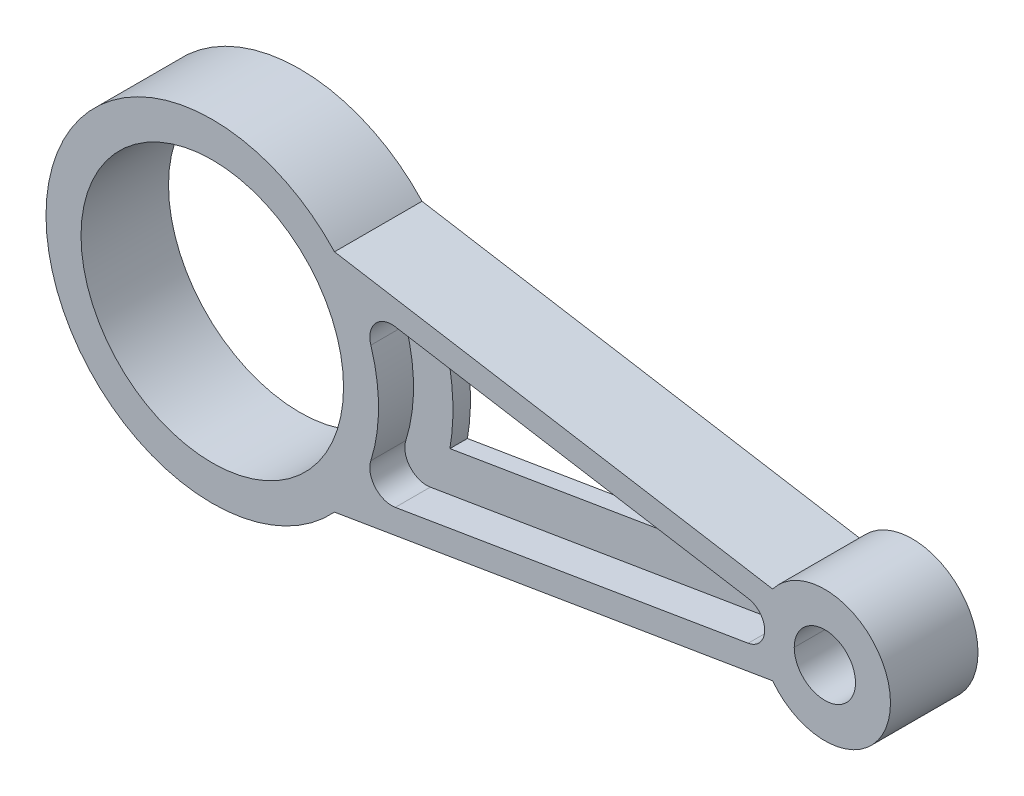
ISO-10303-21;
HEADER;
FILE_DESCRIPTION(('STEP AP214'),'2;1');
FILE_NAME('part.step','',(''),(''),'','','');
FILE_SCHEMA(('AUTOMOTIVE_DESIGN { 1 0 10303 214 1 1 1 1 }'));
ENDSEC;
DATA;
#1=APPLICATION_CONTEXT('core data for automotive mechanical design processes');
#2=APPLICATION_PROTOCOL_DEFINITION('international standard','automotive_design',2000,#1);
#3=PRODUCT_CONTEXT('',#1,'mechanical');
#4=PRODUCT('Part','Part','',(#3));
#5=PRODUCT_RELATED_PRODUCT_CATEGORY('part','',(#4));
#6=PRODUCT_DEFINITION_FORMATION('','',#4);
#7=PRODUCT_DEFINITION_CONTEXT('part definition',#1,'design');
#8=PRODUCT_DEFINITION('design','',#6,#7);
#9=PRODUCT_DEFINITION_SHAPE('','',#8);
#10=(LENGTH_UNIT() NAMED_UNIT(*) SI_UNIT(.MILLI.,.METRE.));
#11=(NAMED_UNIT(*) PLANE_ANGLE_UNIT() SI_UNIT($,.RADIAN.));
#12=(NAMED_UNIT(*) SI_UNIT($,.STERADIAN.) SOLID_ANGLE_UNIT());
#13=UNCERTAINTY_MEASURE_WITH_UNIT(LENGTH_MEASURE(1.E-05),#10,'distance_accuracy_value','');
#14=(GEOMETRIC_REPRESENTATION_CONTEXT(3) GLOBAL_UNCERTAINTY_ASSIGNED_CONTEXT((#13)) GLOBAL_UNIT_ASSIGNED_CONTEXT((#10,
#11,#12)) REPRESENTATION_CONTEXT('',''));
#15=CARTESIAN_POINT('',(0.,0.,0.));
#16=DIRECTION('',(0.,0.,1.));
#17=DIRECTION('',(1.,0.,0.));
#18=AXIS2_PLACEMENT_3D('',#15,#16,#17);
#19=CARTESIAN_POINT('',(41.007125986905,-12.9389187451698,2.));
#20=DIRECTION('',(0.,0.,1.));
#21=DIRECTION('',(1.,0.,0.));
#22=AXIS2_PLACEMENT_3D('',#19,#20,#21);
#23=PLANE('',#22);
#24=CARTESIAN_POINT('',(41.007125986905,-12.9389187451698,2.));
#25=DIRECTION('',(0.,0.,1.));
#26=DIRECTION('',(1.,0.,0.));
#27=AXIS2_PLACEMENT_3D('',#24,#25,#26);
#28=CIRCLE('',#27,5.);
#29=CARTESIAN_POINT('',(36.2388555233114,-11.4343933096849,2.));
#30=VERTEX_POINT('',#29);
#31=CARTESIAN_POINT('',(41.8285545583335,-17.8709827250915,2.));
#32=VERTEX_POINT('',#31);
#33=EDGE_CURVE('E275',#30,#32,#28,.T.);
#34=ORIENTED_EDGE('',*,*,#33,.T.);
#35=DIRECTION('',(0.986412795984335,0.164285714285714,0.));
#36=VECTOR('',#35,1.);
#37=CARTESIAN_POINT('',(122.478416149068,-4.4388575819296,2.));
#38=LINE('',#37,#36);
#39=CARTESIAN_POINT('',(122.478416149068,-4.4388575819296,2.));
#40=VERTEX_POINT('',#39);
#41=EDGE_CURVE('E279',#32,#40,#38,.T.);
#42=ORIENTED_EDGE('',*,*,#41,.T.);
#43=CARTESIAN_POINT('',(121.739130434783,0.,2.));
#44=DIRECTION('',(0.,0.,1.));
#45=DIRECTION('',(-1.,0.,0.));
#46=AXIS2_PLACEMENT_3D('',#43,#44,#45);
#47=CIRCLE('',#46,4.5);
#48=CARTESIAN_POINT('',(122.478416149068,4.4388575819296,2.));
#49=VERTEX_POINT('',#48);
#50=EDGE_CURVE('E284',#40,#49,#47,.T.);
#51=ORIENTED_EDGE('',*,*,#50,.T.);
#52=DIRECTION('',(-0.986412795984335,0.164285714285714,0.));
#53=VECTOR('',#52,1.);
#54=CARTESIAN_POINT('',(41.8285545583335,17.8709827250915,2.));
#55=LINE('',#54,#53);
#56=CARTESIAN_POINT('',(41.8285545583335,17.8709827250915,2.));
#57=VERTEX_POINT('',#56);
#58=EDGE_CURVE('E288',#49,#57,#55,.T.);
#59=ORIENTED_EDGE('',*,*,#58,.T.);
#60=CARTESIAN_POINT('',(41.007125986905,12.9389187451698,2.));
#61=DIRECTION('',(0.,0.,1.));
#62=DIRECTION('',(-1.,0.,0.));
#63=AXIS2_PLACEMENT_3D('',#60,#61,#62);
#64=CIRCLE('',#63,5.);
#65=CARTESIAN_POINT('',(36.2388555233114,11.4343933096849,2.));
#66=VERTEX_POINT('',#65);
#67=EDGE_CURVE('E292',#57,#66,#64,.T.);
#68=ORIENTED_EDGE('',*,*,#67,.T.);
#69=CARTESIAN_POINT('',(0.,0.,2.));
#70=DIRECTION('',(0.,0.,-1.));
#71=DIRECTION('',(1.,0.,0.));
#72=AXIS2_PLACEMENT_3D('',#69,#70,#71);
#73=CIRCLE('',#72,38.);
#74=EDGE_CURVE('E296',#66,#30,#73,.T.);
#75=ORIENTED_EDGE('',*,*,#74,.T.);
#76=EDGE_LOOP('',(#34,#42,#51,#59,#68,#75));
#77=FACE_BOUND('',#76,.T.);
#78=DIRECTION('',(0.986412795984335,0.164285714285714,0.));
#79=VECTOR('',#78,1.);
#80=CARTESIAN_POINT('',(2.54642857142857,-15.2893983377572,2.));
#81=LINE('',#80,#79);
#82=CARTESIAN_POINT('',(46.3141545722813,-7.99994289072374,2.));
#83=VERTEX_POINT('',#82);
#84=CARTESIAN_POINT('',(94.3478260869566,0.,2.));
#85=VERTEX_POINT('',#84);
#86=EDGE_CURVE('E59',#83,#85,#81,.T.);
#87=ORIENTED_EDGE('',*,*,#86,.F.);
#88=CARTESIAN_POINT('',(0.,0.,2.));
#89=DIRECTION('',(0.,0.,1.));
#90=DIRECTION('',(1.,0.,0.));
#91=AXIS2_PLACEMENT_3D('',#88,#89,#90);
#92=CIRCLE('',#91,47.);
#93=CARTESIAN_POINT('',(46.3141545722813,7.99994289072373,2.));
#94=VERTEX_POINT('',#93);
#95=EDGE_CURVE('E193',#83,#94,#92,.T.);
#96=ORIENTED_EDGE('',*,*,#95,.T.);
#97=DIRECTION('',(-0.986412795984335,0.164285714285714,0.));
#98=VECTOR('',#97,1.);
#99=CARTESIAN_POINT('',(2.54642857142857,15.2893983377572,2.));
#100=LINE('',#99,#98);
#101=EDGE_CURVE('E190',#85,#94,#100,.T.);
#102=ORIENTED_EDGE('',*,*,#101,.F.);
#103=EDGE_LOOP('',(#87,#96,#102));
#104=FACE_BOUND('',#103,.T.);
#105=ADVANCED_FACE('F43',(#77,#104),#23,.T.);
#106=CARTESIAN_POINT('',(41.007125986905,-12.9389187451698,-2.));
#107=DIRECTION('',(0.,0.,-1.));
#108=DIRECTION('',(1.,0.,0.));
#109=AXIS2_PLACEMENT_3D('',#106,#107,#108);
#110=PLANE('',#109);
#111=CARTESIAN_POINT('',(41.007125986905,-12.9389187451698,-2.));
#112=DIRECTION('',(0.,0.,1.));
#113=DIRECTION('',(1.,0.,0.));
#114=AXIS2_PLACEMENT_3D('',#111,#112,#113);
#115=CIRCLE('',#114,5.);
#116=CARTESIAN_POINT('',(36.2388555233114,-11.4343933096849,-2.));
#117=VERTEX_POINT('',#116);
#118=CARTESIAN_POINT('',(41.8285545583335,-17.8709827250915,-2.));
#119=VERTEX_POINT('',#118);
#120=EDGE_CURVE('E212',#117,#119,#115,.T.);
#121=ORIENTED_EDGE('',*,*,#120,.F.);
#122=CARTESIAN_POINT('',(0.,0.,-2.));
#123=DIRECTION('',(0.,0.,-1.));
#124=DIRECTION('',(1.,0.,0.));
#125=AXIS2_PLACEMENT_3D('',#122,#123,#124);
#126=CIRCLE('',#125,38.);
#127=CARTESIAN_POINT('',(36.2388555233114,11.4343933096849,-2.));
#128=VERTEX_POINT('',#127);
#129=EDGE_CURVE('E216',#128,#117,#126,.T.);
#130=ORIENTED_EDGE('',*,*,#129,.F.);
#131=CARTESIAN_POINT('',(41.007125986905,12.9389187451698,-2.));
#132=DIRECTION('',(0.,0.,1.));
#133=DIRECTION('',(-1.,0.,0.));
#134=AXIS2_PLACEMENT_3D('',#131,#132,#133);
#135=CIRCLE('',#134,5.);
#136=CARTESIAN_POINT('',(41.8285545583335,17.8709827250915,-2.));
#137=VERTEX_POINT('',#136);
#138=EDGE_CURVE('E220',#137,#128,#135,.T.);
#139=ORIENTED_EDGE('',*,*,#138,.F.);
#140=DIRECTION('',(-0.986412795984335,0.164285714285714,0.));
#141=VECTOR('',#140,1.);
#142=CARTESIAN_POINT('',(41.8285545583335,17.8709827250915,-2.));
#143=LINE('',#142,#141);
#144=CARTESIAN_POINT('',(122.478416149068,4.4388575819296,-2.));
#145=VERTEX_POINT('',#144);
#146=EDGE_CURVE('E223',#145,#137,#143,.T.);
#147=ORIENTED_EDGE('',*,*,#146,.F.);
#148=CARTESIAN_POINT('',(121.739130434783,0.,-2.));
#149=DIRECTION('',(0.,0.,1.));
#150=DIRECTION('',(-1.,0.,0.));
#151=AXIS2_PLACEMENT_3D('',#148,#149,#150);
#152=CIRCLE('',#151,4.5);
#153=CARTESIAN_POINT('',(122.478416149068,-4.4388575819296,-2.));
#154=VERTEX_POINT('',#153);
#155=EDGE_CURVE('E226',#154,#145,#152,.T.);
#156=ORIENTED_EDGE('',*,*,#155,.F.);
#157=DIRECTION('',(0.986412795984335,0.164285714285714,0.));
#158=VECTOR('',#157,1.);
#159=CARTESIAN_POINT('',(122.478416149068,-4.4388575819296,-2.));
#160=LINE('',#159,#158);
#161=EDGE_CURVE('E229',#119,#154,#160,.T.);
#162=ORIENTED_EDGE('',*,*,#161,.F.);
#163=EDGE_LOOP('',(#121,#130,#139,#147,#156,#162));
#164=FACE_BOUND('',#163,.T.);
#165=DIRECTION('',(0.986412795984335,-0.164285714285714,0.));
#166=VECTOR('',#165,1.);
#167=CARTESIAN_POINT('',(44.5435780637343,8.29483000855951,-2.));
#168=LINE('',#167,#166);
#169=CARTESIAN_POINT('',(46.3141545722813,7.99994289072373,-2.));
#170=VERTEX_POINT('',#169);
#171=CARTESIAN_POINT('',(94.3478260869566,0.,-2.));
#172=VERTEX_POINT('',#171);
#173=EDGE_CURVE('E52',#170,#172,#168,.T.);
#174=ORIENTED_EDGE('',*,*,#173,.F.);
#175=CARTESIAN_POINT('',(0.,0.,-2.));
#176=DIRECTION('',(0.,0.,-1.));
#177=DIRECTION('',(-1.,0.,0.));
#178=AXIS2_PLACEMENT_3D('',#175,#176,#177);
#179=CIRCLE('',#178,47.);
#180=CARTESIAN_POINT('',(46.3141545722813,-7.99994289072374,-2.));
#181=VERTEX_POINT('',#180);
#182=EDGE_CURVE('E11',#170,#181,#179,.T.);
#183=ORIENTED_EDGE('',*,*,#182,.T.);
#184=DIRECTION('',(-0.986412795984335,-0.164285714285714,0.));
#185=VECTOR('',#184,1.);
#186=CARTESIAN_POINT('',(40.3499831297621,-8.99326756123246,-2.));
#187=LINE('',#186,#185);
#188=EDGE_CURVE('E187',#172,#181,#187,.T.);
#189=ORIENTED_EDGE('',*,*,#188,.F.);
#190=EDGE_LOOP('',(#174,#183,#189));
#191=FACE_BOUND('',#190,.T.);
#192=ADVANCED_FACE('F413',(#164,#191),#110,.T.);
#193=CARTESIAN_POINT('',(140.,0.,10.));
#194=DIRECTION('',(0.,0.,-1.));
#195=DIRECTION('',(-1.,0.,0.));
#196=AXIS2_PLACEMENT_3D('',#193,#194,#195);
#197=CYLINDRICAL_SURFACE('',#196,7.00000000000001);
#198=CARTESIAN_POINT('',(140.,0.,10.));
#199=DIRECTION('',(0.,0.,1.));
#200=DIRECTION('',(1.,0.,0.));
#201=AXIS2_PLACEMENT_3D('',#198,#199,#200);
#202=CIRCLE('',#201,7.00000000000001);
#203=CARTESIAN_POINT('',(133.,0.,10.));
#204=VERTEX_POINT('',#203);
#205=CARTESIAN_POINT('',(147.,0.,10.));
#206=VERTEX_POINT('',#205);
#207=EDGE_CURVE('E341',#204,#206,#202,.T.);
#208=ORIENTED_EDGE('',*,*,#207,.T.);
#209=DIRECTION('',(0.,0.,-1.));
#210=VECTOR('',#209,1.);
#211=CARTESIAN_POINT('',(147.,0.,10.));
#212=LINE('',#211,#210);
#213=CARTESIAN_POINT('',(147.,0.,-10.));
#214=VERTEX_POINT('',#213);
#215=EDGE_CURVE('E404',#206,#214,#212,.T.);
#216=ORIENTED_EDGE('',*,*,#215,.T.);
#217=CARTESIAN_POINT('',(140.,0.,-10.));
#218=DIRECTION('',(0.,0.,1.));
#219=DIRECTION('',(1.,0.,0.));
#220=AXIS2_PLACEMENT_3D('',#217,#218,#219);
#221=CIRCLE('',#220,7.00000000000001);
#222=CARTESIAN_POINT('',(133.,0.,-10.));
#223=VERTEX_POINT('',#222);
#224=EDGE_CURVE('E347',#223,#214,#221,.T.);
#225=ORIENTED_EDGE('',*,*,#224,.F.);
#226=DIRECTION('',(0.,0.,1.));
#227=VECTOR('',#226,1.);
#228=CARTESIAN_POINT('',(133.,0.,10.));
#229=LINE('',#228,#227);
#230=EDGE_CURVE('E400',#223,#204,#229,.T.);
#231=ORIENTED_EDGE('',*,*,#230,.T.);
#232=EDGE_LOOP('',(#208,#216,#225,#231));
#233=FACE_BOUND('',#232,.T.);
#234=ADVANCED_FACE('F415',(#233),#197,.F.);
#235=CARTESIAN_POINT('',(0.,0.,-10.));
#236=DIRECTION('',(0.,0.,1.));
#237=DIRECTION('',(1.,0.,0.));
#238=AXIS2_PLACEMENT_3D('',#235,#236,#237);
#239=PLANE('',#238);
#240=ORIENTED_EDGE('',*,*,#224,.T.);
#241=EDGE_CURVE('E325',#214,#223,#221,.T.);
#242=ORIENTED_EDGE('',*,*,#241,.T.);
#243=EDGE_LOOP('',(#240,#242));
#244=FACE_BOUND('',#243,.T.);
#245=CARTESIAN_POINT('',(0.,0.,-10.));
#246=DIRECTION('',(0.,0.,1.));
#247=DIRECTION('',(1.,0.,0.));
#248=AXIS2_PLACEMENT_3D('',#245,#246,#247);
#249=CIRCLE('',#248,30.);
#250=CARTESIAN_POINT('',(30.,0.,-10.));
#251=VERTEX_POINT('',#250);
#252=EDGE_CURVE('E345',#251,#251,#249,.T.);
#253=ORIENTED_EDGE('',*,*,#252,.T.);
#254=EDGE_LOOP('',(#253));
#255=FACE_BOUND('',#254,.T.);
#256=CARTESIAN_POINT('',(0.,0.,-10.));
#257=DIRECTION('',(0.,0.,1.));
#258=DIRECTION('',(1.,0.,0.));
#259=AXIS2_PLACEMENT_3D('',#256,#257,#258);
#260=CIRCLE('',#259,38.);
#261=CARTESIAN_POINT('',(27.9354736759495,25.7606154914888,-10.));
#262=VERTEX_POINT('',#261);
#263=CARTESIAN_POINT('',(27.9354736759495,-25.7606154914888,-10.));
#264=VERTEX_POINT('',#263);
#265=EDGE_CURVE('E355',#262,#264,#260,.T.);
#266=ORIENTED_EDGE('',*,*,#265,.F.);
#267=DIRECTION('',(-0.986412795984335,0.164285714285714,0.));
#268=VECTOR('',#267,1.);
#269=CARTESIAN_POINT('',(27.9354736759495,25.7606154914888,-10.));
#270=LINE('',#269,#268);
#271=CARTESIAN_POINT('',(128.063755469258,9.08438586269532,-10.));
#272=VERTEX_POINT('',#271);
#273=EDGE_CURVE('E364',#272,#262,#270,.T.);
#274=ORIENTED_EDGE('',*,*,#273,.F.);
#275=CARTESIAN_POINT('',(140.,0.,-10.));
#276=DIRECTION('',(0.,0.,1.));
#277=DIRECTION('',(1.,0.,0.));
#278=AXIS2_PLACEMENT_3D('',#275,#276,#277);
#279=CIRCLE('',#278,15.);
#280=CARTESIAN_POINT('',(128.063755469258,-9.08438586269532,-10.));
#281=VERTEX_POINT('',#280);
#282=EDGE_CURVE('E380',#281,#272,#279,.T.);
#283=ORIENTED_EDGE('',*,*,#282,.F.);
#284=DIRECTION('',(0.986412795984335,0.164285714285714,0.));
#285=VECTOR('',#284,1.);
#286=CARTESIAN_POINT('',(27.9354736759495,-25.7606154914888,-10.));
#287=LINE('',#286,#285);
#288=EDGE_CURVE('E377',#264,#281,#287,.T.);
#289=ORIENTED_EDGE('',*,*,#288,.F.);
#290=EDGE_LOOP('',(#266,#274,#283,#289));
#291=FACE_BOUND('',#290,.T.);
#292=CARTESIAN_POINT('',(41.007125986905,-12.9389187451698,-10.));
#293=DIRECTION('',(0.,0.,1.));
#294=DIRECTION('',(1.,0.,0.));
#295=AXIS2_PLACEMENT_3D('',#292,#293,#294);
#296=CIRCLE('',#295,5.);
#297=CARTESIAN_POINT('',(36.2388555233114,-11.4343933096849,-10.));
#298=VERTEX_POINT('',#297);
#299=CARTESIAN_POINT('',(41.8285545583335,-17.8709827250915,-10.));
#300=VERTEX_POINT('',#299);
#301=EDGE_CURVE('E209',#298,#300,#296,.T.);
#302=ORIENTED_EDGE('',*,*,#301,.T.);
#303=DIRECTION('',(0.986412795984335,0.164285714285714,0.));
#304=VECTOR('',#303,1.);
#305=CARTESIAN_POINT('',(122.478416149068,-4.4388575819296,-10.));
#306=LINE('',#305,#304);
#307=CARTESIAN_POINT('',(122.478416149068,-4.4388575819296,-10.));
#308=VERTEX_POINT('',#307);
#309=EDGE_CURVE('E217',#300,#308,#306,.T.);
#310=ORIENTED_EDGE('',*,*,#309,.T.);
#311=CARTESIAN_POINT('',(121.739130434783,0.,-10.));
#312=DIRECTION('',(0.,0.,1.));
#313=DIRECTION('',(-1.,0.,0.));
#314=AXIS2_PLACEMENT_3D('',#311,#312,#313);
#315=CIRCLE('',#314,4.5);
#316=CARTESIAN_POINT('',(122.478416149068,4.4388575819296,-10.));
#317=VERTEX_POINT('',#316);
#318=EDGE_CURVE('E248',#308,#317,#315,.T.);
#319=ORIENTED_EDGE('',*,*,#318,.T.);
#320=DIRECTION('',(-0.986412795984335,0.164285714285714,0.));
#321=VECTOR('',#320,1.);
#322=CARTESIAN_POINT('',(41.8285545583335,17.8709827250915,-10.));
#323=LINE('',#322,#321);
#324=CARTESIAN_POINT('',(41.8285545583335,17.8709827250915,-10.));
#325=VERTEX_POINT('',#324);
#326=EDGE_CURVE('E244',#317,#325,#323,.T.);
#327=ORIENTED_EDGE('',*,*,#326,.T.);
#328=CARTESIAN_POINT('',(41.007125986905,12.9389187451698,-10.));
#329=DIRECTION('',(0.,0.,1.));
#330=DIRECTION('',(-1.,0.,0.));
#331=AXIS2_PLACEMENT_3D('',#328,#329,#330);
#332=CIRCLE('',#331,5.);
#333=CARTESIAN_POINT('',(36.2388555233114,11.4343933096849,-10.));
#334=VERTEX_POINT('',#333);
#335=EDGE_CURVE('E240',#325,#334,#332,.T.);
#336=ORIENTED_EDGE('',*,*,#335,.T.);
#337=CARTESIAN_POINT('',(0.,0.,-10.));
#338=DIRECTION('',(0.,0.,-1.));
#339=DIRECTION('',(1.,0.,0.));
#340=AXIS2_PLACEMENT_3D('',#337,#338,#339);
#341=CIRCLE('',#340,38.);
#342=EDGE_CURVE('E236',#334,#298,#341,.T.);
#343=ORIENTED_EDGE('',*,*,#342,.T.);
#344=EDGE_LOOP('',(#302,#310,#319,#327,#336,#343));
#345=FACE_BOUND('',#344,.T.);
#346=ADVANCED_FACE('F422',(#244,#255,#291,#345),#239,.F.);
#347=CARTESIAN_POINT('',(0.,0.,10.));
#348=DIRECTION('',(0.,0.,1.));
#349=DIRECTION('',(1.,0.,0.));
#350=AXIS2_PLACEMENT_3D('',#347,#348,#349);
#351=PLANE('',#350);
#352=CARTESIAN_POINT('',(41.007125986905,-12.9389187451698,10.));
#353=DIRECTION('',(0.,0.,1.));
#354=DIRECTION('',(1.,0.,0.));
#355=AXIS2_PLACEMENT_3D('',#352,#353,#354);
#356=CIRCLE('',#355,5.);
#357=CARTESIAN_POINT('',(36.2388555233114,-11.4343933096849,10.));
#358=VERTEX_POINT('',#357);
#359=CARTESIAN_POINT('',(41.8285545583335,-17.8709827250915,10.));
#360=VERTEX_POINT('',#359);
#361=EDGE_CURVE('E259',#358,#360,#356,.T.);
#362=ORIENTED_EDGE('',*,*,#361,.F.);
#363=CARTESIAN_POINT('',(0.,0.,10.));
#364=DIRECTION('',(0.,0.,-1.));
#365=DIRECTION('',(1.,0.,0.));
#366=AXIS2_PLACEMENT_3D('',#363,#364,#365);
#367=CIRCLE('',#366,38.);
#368=CARTESIAN_POINT('',(36.2388555233114,11.4343933096849,10.));
#369=VERTEX_POINT('',#368);
#370=EDGE_CURVE('E280',#369,#358,#367,.T.);
#371=ORIENTED_EDGE('',*,*,#370,.F.);
#372=CARTESIAN_POINT('',(41.007125986905,12.9389187451698,10.));
#373=DIRECTION('',(0.,0.,1.));
#374=DIRECTION('',(-1.,0.,0.));
#375=AXIS2_PLACEMENT_3D('',#372,#373,#374);
#376=CIRCLE('',#375,5.);
#377=CARTESIAN_POINT('',(41.8285545583335,17.8709827250915,10.));
#378=VERTEX_POINT('',#377);
#379=EDGE_CURVE('E315',#378,#369,#376,.T.);
#380=ORIENTED_EDGE('',*,*,#379,.F.);
#381=DIRECTION('',(-0.986412795984335,0.164285714285714,0.));
#382=VECTOR('',#381,1.);
#383=CARTESIAN_POINT('',(41.8285545583335,17.8709827250915,10.));
#384=LINE('',#383,#382);
#385=CARTESIAN_POINT('',(122.478416149068,4.4388575819296,10.));
#386=VERTEX_POINT('',#385);
#387=EDGE_CURVE('E311',#386,#378,#384,.T.);
#388=ORIENTED_EDGE('',*,*,#387,.F.);
#389=CARTESIAN_POINT('',(121.739130434783,0.,10.));
#390=DIRECTION('',(0.,0.,1.));
#391=DIRECTION('',(-1.,0.,0.));
#392=AXIS2_PLACEMENT_3D('',#389,#390,#391);
#393=CIRCLE('',#392,4.5);
#394=CARTESIAN_POINT('',(122.478416149068,-4.4388575819296,10.));
#395=VERTEX_POINT('',#394);
#396=EDGE_CURVE('E307',#395,#386,#393,.T.);
#397=ORIENTED_EDGE('',*,*,#396,.F.);
#398=DIRECTION('',(0.986412795984335,0.164285714285714,0.));
#399=VECTOR('',#398,1.);
#400=CARTESIAN_POINT('',(122.478416149068,-4.4388575819296,10.));
#401=LINE('',#400,#399);
#402=EDGE_CURVE('E303',#360,#395,#401,.T.);
#403=ORIENTED_EDGE('',*,*,#402,.F.);
#404=EDGE_LOOP('',(#362,#371,#380,#388,#397,#403));
#405=FACE_BOUND('',#404,.T.);
#406=CARTESIAN_POINT('',(0.,0.,10.));
#407=DIRECTION('',(0.,0.,1.));
#408=DIRECTION('',(1.,0.,0.));
#409=AXIS2_PLACEMENT_3D('',#406,#407,#408);
#410=CIRCLE('',#409,30.);
#411=CARTESIAN_POINT('',(30.,0.,10.));
#412=VERTEX_POINT('',#411);
#413=EDGE_CURVE('E351',#412,#412,#410,.T.);
#414=ORIENTED_EDGE('',*,*,#413,.F.);
#415=EDGE_LOOP('',(#414));
#416=FACE_BOUND('',#415,.T.);
#417=CARTESIAN_POINT('',(0.,0.,10.));
#418=DIRECTION('',(0.,0.,1.));
#419=DIRECTION('',(1.,0.,0.));
#420=AXIS2_PLACEMENT_3D('',#417,#418,#419);
#421=CIRCLE('',#420,38.);
#422=CARTESIAN_POINT('',(27.9354736759495,25.7606154914888,10.));
#423=VERTEX_POINT('',#422);
#424=CARTESIAN_POINT('',(27.9354736759495,-25.7606154914888,10.));
#425=VERTEX_POINT('',#424);
#426=EDGE_CURVE('E359',#423,#425,#421,.T.);
#427=ORIENTED_EDGE('',*,*,#426,.T.);
#428=DIRECTION('',(0.986412795984335,0.164285714285714,0.));
#429=VECTOR('',#428,1.);
#430=CARTESIAN_POINT('',(27.9354736759495,-25.7606154914888,10.));
#431=LINE('',#430,#429);
#432=CARTESIAN_POINT('',(128.063755469258,-9.08438586269532,10.));
#433=VERTEX_POINT('',#432);
#434=EDGE_CURVE('E363',#425,#433,#431,.T.);
#435=ORIENTED_EDGE('',*,*,#434,.T.);
#436=CARTESIAN_POINT('',(140.,0.,10.));
#437=DIRECTION('',(0.,0.,1.));
#438=DIRECTION('',(1.,0.,0.));
#439=AXIS2_PLACEMENT_3D('',#436,#437,#438);
#440=CIRCLE('',#439,15.);
#441=CARTESIAN_POINT('',(128.063755469258,9.08438586269532,10.));
#442=VERTEX_POINT('',#441);
#443=EDGE_CURVE('E367',#433,#442,#440,.T.);
#444=ORIENTED_EDGE('',*,*,#443,.T.);
#445=DIRECTION('',(-0.986412795984335,0.164285714285714,0.));
#446=VECTOR('',#445,1.);
#447=CARTESIAN_POINT('',(27.9354736759495,25.7606154914888,10.));
#448=LINE('',#447,#446);
#449=EDGE_CURVE('E370',#442,#423,#448,.T.);
#450=ORIENTED_EDGE('',*,*,#449,.T.);
#451=EDGE_LOOP('',(#427,#435,#444,#450));
#452=FACE_BOUND('',#451,.T.);
#453=ORIENTED_EDGE('',*,*,#207,.F.);
#454=EDGE_CURVE('E346',#206,#204,#202,.T.);
#455=ORIENTED_EDGE('',*,*,#454,.F.);
#456=EDGE_LOOP('',(#453,#455));
#457=FACE_BOUND('',#456,.T.);
#458=ADVANCED_FACE('F487',(#405,#416,#452,#457),#351,.T.);
#459=CARTESIAN_POINT('',(0.,0.,10.));
#460=DIRECTION('',(0.,0.,-1.));
#461=DIRECTION('',(-1.,0.,0.));
#462=AXIS2_PLACEMENT_3D('',#459,#460,#461);
#463=CYLINDRICAL_SURFACE('',#462,38.);
#464=ORIENTED_EDGE('',*,*,#265,.T.);
#465=DIRECTION('',(0.,0.,-1.));
#466=VECTOR('',#465,1.);
#467=CARTESIAN_POINT('',(27.9354736759495,-25.7606154914888,10.));
#468=LINE('',#467,#466);
#469=EDGE_CURVE('E396',#425,#264,#468,.T.);
#470=ORIENTED_EDGE('',*,*,#469,.F.);
#471=ORIENTED_EDGE('',*,*,#426,.F.);
#472=DIRECTION('',(0.,0.,-1.));
#473=VECTOR('',#472,1.);
#474=CARTESIAN_POINT('',(27.9354736759495,25.7606154914888,10.));
#475=LINE('',#474,#473);
#476=EDGE_CURVE('E373',#423,#262,#475,.T.);
#477=ORIENTED_EDGE('',*,*,#476,.T.);
#478=EDGE_LOOP('',(#464,#470,#471,#477));
#479=FACE_BOUND('',#478,.T.);
#480=ADVANCED_FACE('F45',(#479),#463,.T.);
#481=CARTESIAN_POINT('',(27.9354736759495,-25.7606154914888,10.));
#482=DIRECTION('',(-0.164285714285714,0.986412795984335,0.));
#483=DIRECTION('',(-0.986412795984335,-0.164285714285714,0.));
#484=AXIS2_PLACEMENT_3D('',#481,#482,#483);
#485=PLANE('',#484);
#486=ORIENTED_EDGE('',*,*,#288,.T.);
#487=DIRECTION('',(0.,0.,-1.));
#488=VECTOR('',#487,1.);
#489=CARTESIAN_POINT('',(128.063755469258,-9.08438586269532,10.));
#490=LINE('',#489,#488);
#491=EDGE_CURVE('E392',#433,#281,#490,.T.);
#492=ORIENTED_EDGE('',*,*,#491,.F.);
#493=ORIENTED_EDGE('',*,*,#434,.F.);
#494=ORIENTED_EDGE('',*,*,#469,.T.);
#495=EDGE_LOOP('',(#486,#492,#493,#494));
#496=FACE_BOUND('',#495,.T.);
#497=ADVANCED_FACE('F499',(#496),#485,.F.);
#498=CARTESIAN_POINT('',(140.,0.,10.));
#499=DIRECTION('',(0.,0.,-1.));
#500=DIRECTION('',(-1.,0.,0.));
#501=AXIS2_PLACEMENT_3D('',#498,#499,#500);
#502=CYLINDRICAL_SURFACE('',#501,15.);
#503=ORIENTED_EDGE('',*,*,#282,.T.);
#504=DIRECTION('',(0.,0.,-1.));
#505=VECTOR('',#504,1.);
#506=CARTESIAN_POINT('',(128.063755469258,9.08438586269532,10.));
#507=LINE('',#506,#505);
#508=EDGE_CURVE('E388',#442,#272,#507,.T.);
#509=ORIENTED_EDGE('',*,*,#508,.F.);
#510=ORIENTED_EDGE('',*,*,#443,.F.);
#511=ORIENTED_EDGE('',*,*,#491,.T.);
#512=EDGE_LOOP('',(#503,#509,#510,#511));
#513=FACE_BOUND('',#512,.T.);
#514=ADVANCED_FACE('F496',(#513),#502,.T.);
#515=CARTESIAN_POINT('',(27.9354736759495,25.7606154914888,10.));
#516=DIRECTION('',(-0.164285714285714,-0.986412795984335,0.));
#517=DIRECTION('',(0.986412795984335,-0.164285714285714,0.));
#518=AXIS2_PLACEMENT_3D('',#515,#516,#517);
#519=PLANE('',#518);
#520=ORIENTED_EDGE('',*,*,#273,.T.);
#521=ORIENTED_EDGE('',*,*,#476,.F.);
#522=ORIENTED_EDGE('',*,*,#449,.F.);
#523=ORIENTED_EDGE('',*,*,#508,.T.);
#524=EDGE_LOOP('',(#520,#521,#522,#523));
#525=FACE_BOUND('',#524,.T.);
#526=ADVANCED_FACE('F485',(#525),#519,.F.);
#527=CARTESIAN_POINT('',(0.,0.,10.));
#528=DIRECTION('',(0.,0.,-1.));
#529=DIRECTION('',(-1.,0.,0.));
#530=AXIS2_PLACEMENT_3D('',#527,#528,#529);
#531=CYLINDRICAL_SURFACE('',#530,30.);
#532=ORIENTED_EDGE('',*,*,#413,.T.);
#533=EDGE_LOOP('',(#532));
#534=FACE_BOUND('',#533,.T.);
#535=ORIENTED_EDGE('',*,*,#252,.F.);
#536=EDGE_LOOP('',(#535));
#537=FACE_BOUND('',#536,.T.);
#538=ADVANCED_FACE('F481',(#534,#537),#531,.F.);
#539=ORIENTED_EDGE('',*,*,#215,.F.);
#540=ORIENTED_EDGE('',*,*,#454,.T.);
#541=ORIENTED_EDGE('',*,*,#230,.F.);
#542=ORIENTED_EDGE('',*,*,#241,.F.);
#543=EDGE_LOOP('',(#539,#540,#541,#542));
#544=FACE_BOUND('',#543,.T.);
#545=ADVANCED_FACE('F425',(#544),#197,.F.);
#546=CARTESIAN_POINT('',(41.007125986905,-12.9389187451698,2.));
#547=DIRECTION('',(0.,0.,1.));
#548=DIRECTION('',(1.,0.,0.));
#549=AXIS2_PLACEMENT_3D('',#546,#547,#548);
#550=CYLINDRICAL_SURFACE('',#549,5.);
#551=ORIENTED_EDGE('',*,*,#361,.T.);
#552=DIRECTION('',(0.,0.,1.));
#553=VECTOR('',#552,1.);
#554=CARTESIAN_POINT('',(41.8285545583335,-17.8709827250915,2.));
#555=LINE('',#554,#553);
#556=EDGE_CURVE('E300',#32,#360,#555,.T.);
#557=ORIENTED_EDGE('',*,*,#556,.F.);
#558=ORIENTED_EDGE('',*,*,#33,.F.);
#559=DIRECTION('',(0.,0.,1.));
#560=VECTOR('',#559,1.);
#561=CARTESIAN_POINT('',(36.2388555233114,-11.4343933096849,2.));
#562=LINE('',#561,#560);
#563=EDGE_CURVE('E322',#30,#358,#562,.T.);
#564=ORIENTED_EDGE('',*,*,#563,.T.);
#565=EDGE_LOOP('',(#551,#557,#558,#564));
#566=FACE_BOUND('',#565,.T.);
#567=ADVANCED_FACE('F461',(#566),#550,.F.);
#568=CARTESIAN_POINT('',(0.,0.,2.));
#569=DIRECTION('',(0.,0.,1.));
#570=DIRECTION('',(1.,0.,0.));
#571=AXIS2_PLACEMENT_3D('',#568,#569,#570);
#572=CYLINDRICAL_SURFACE('',#571,38.);
#573=ORIENTED_EDGE('',*,*,#370,.T.);
#574=ORIENTED_EDGE('',*,*,#563,.F.);
#575=ORIENTED_EDGE('',*,*,#74,.F.);
#576=DIRECTION('',(0.,0.,1.));
#577=VECTOR('',#576,1.);
#578=CARTESIAN_POINT('',(36.2388555233114,11.4343933096849,2.));
#579=LINE('',#578,#577);
#580=EDGE_CURVE('E326',#66,#369,#579,.T.);
#581=ORIENTED_EDGE('',*,*,#580,.T.);
#582=EDGE_LOOP('',(#573,#574,#575,#581));
#583=FACE_BOUND('',#582,.T.);
#584=ADVANCED_FACE('F457',(#583),#572,.T.);
#585=CARTESIAN_POINT('',(41.007125986905,12.9389187451698,2.));
#586=DIRECTION('',(0.,0.,1.));
#587=DIRECTION('',(1.,0.,0.));
#588=AXIS2_PLACEMENT_3D('',#585,#586,#587);
#589=CYLINDRICAL_SURFACE('',#588,5.);
#590=ORIENTED_EDGE('',*,*,#379,.T.);
#591=ORIENTED_EDGE('',*,*,#580,.F.);
#592=ORIENTED_EDGE('',*,*,#67,.F.);
#593=DIRECTION('',(0.,0.,1.));
#594=VECTOR('',#593,1.);
#595=CARTESIAN_POINT('',(41.8285545583335,17.8709827250915,2.));
#596=LINE('',#595,#594);
#597=EDGE_CURVE('E329',#57,#378,#596,.T.);
#598=ORIENTED_EDGE('',*,*,#597,.T.);
#599=EDGE_LOOP('',(#590,#591,#592,#598));
#600=FACE_BOUND('',#599,.T.);
#601=ADVANCED_FACE('F460',(#600),#589,.F.);
#602=CARTESIAN_POINT('',(41.8285545583335,17.8709827250915,2.));
#603=DIRECTION('',(0.164285714285714,0.986412795984335,0.));
#604=DIRECTION('',(-0.986412795984335,0.164285714285714,0.));
#605=AXIS2_PLACEMENT_3D('',#602,#603,#604);
#606=PLANE('',#605);
#607=ORIENTED_EDGE('',*,*,#387,.T.);
#608=ORIENTED_EDGE('',*,*,#597,.F.);
#609=ORIENTED_EDGE('',*,*,#58,.F.);
#610=DIRECTION('',(0.,0.,1.));
#611=VECTOR('',#610,1.);
#612=CARTESIAN_POINT('',(122.478416149068,4.4388575819296,2.));
#613=LINE('',#612,#611);
#614=EDGE_CURVE('E332',#49,#386,#613,.T.);
#615=ORIENTED_EDGE('',*,*,#614,.T.);
#616=EDGE_LOOP('',(#607,#608,#609,#615));
#617=FACE_BOUND('',#616,.T.);
#618=ADVANCED_FACE('F465',(#617),#606,.F.);
#619=CARTESIAN_POINT('',(121.739130434783,0.,2.));
#620=DIRECTION('',(0.,0.,1.));
#621=DIRECTION('',(1.,0.,0.));
#622=AXIS2_PLACEMENT_3D('',#619,#620,#621);
#623=CYLINDRICAL_SURFACE('',#622,4.5);
#624=ORIENTED_EDGE('',*,*,#396,.T.);
#625=ORIENTED_EDGE('',*,*,#614,.F.);
#626=ORIENTED_EDGE('',*,*,#50,.F.);
#627=DIRECTION('',(0.,0.,1.));
#628=VECTOR('',#627,1.);
#629=CARTESIAN_POINT('',(122.478416149068,-4.4388575819296,2.));
#630=LINE('',#629,#628);
#631=EDGE_CURVE('E335',#40,#395,#630,.T.);
#632=ORIENTED_EDGE('',*,*,#631,.T.);
#633=EDGE_LOOP('',(#624,#625,#626,#632));
#634=FACE_BOUND('',#633,.T.);
#635=ADVANCED_FACE('F469',(#634),#623,.F.);
#636=CARTESIAN_POINT('',(122.478416149068,-4.4388575819296,2.));
#637=DIRECTION('',(0.164285714285714,-0.986412795984335,0.));
#638=DIRECTION('',(0.986412795984335,0.164285714285714,0.));
#639=AXIS2_PLACEMENT_3D('',#636,#637,#638);
#640=PLANE('',#639);
#641=ORIENTED_EDGE('',*,*,#402,.T.);
#642=ORIENTED_EDGE('',*,*,#631,.F.);
#643=ORIENTED_EDGE('',*,*,#41,.F.);
#644=ORIENTED_EDGE('',*,*,#556,.T.);
#645=EDGE_LOOP('',(#641,#642,#643,#644));
#646=FACE_BOUND('',#645,.T.);
#647=ADVANCED_FACE('F454',(#646),#640,.F.);
#648=CARTESIAN_POINT('',(41.007125986905,-12.9389187451698,-2.));
#649=DIRECTION('',(0.,0.,-1.));
#650=DIRECTION('',(-1.,0.,0.));
#651=AXIS2_PLACEMENT_3D('',#648,#649,#650);
#652=CYLINDRICAL_SURFACE('',#651,5.);
#653=ORIENTED_EDGE('',*,*,#301,.F.);
#654=DIRECTION('',(0.,0.,-1.));
#655=VECTOR('',#654,1.);
#656=CARTESIAN_POINT('',(36.2388555233114,-11.4343933096849,-2.));
#657=LINE('',#656,#655);
#658=EDGE_CURVE('E232',#117,#298,#657,.T.);
#659=ORIENTED_EDGE('',*,*,#658,.F.);
#660=ORIENTED_EDGE('',*,*,#120,.T.);
#661=DIRECTION('',(0.,0.,-1.));
#662=VECTOR('',#661,1.);
#663=CARTESIAN_POINT('',(41.8285545583335,-17.8709827250915,-2.));
#664=LINE('',#663,#662);
#665=EDGE_CURVE('E255',#119,#300,#664,.T.);
#666=ORIENTED_EDGE('',*,*,#665,.T.);
#667=EDGE_LOOP('',(#653,#659,#660,#666));
#668=FACE_BOUND('',#667,.T.);
#669=ADVANCED_FACE('F436',(#668),#652,.F.);
#670=CARTESIAN_POINT('',(122.478416149068,-4.4388575819296,-2.));
#671=DIRECTION('',(-0.164285714285714,0.986412795984335,0.));
#672=DIRECTION('',(-0.986412795984335,-0.164285714285714,0.));
#673=AXIS2_PLACEMENT_3D('',#670,#671,#672);
#674=PLANE('',#673);
#675=ORIENTED_EDGE('',*,*,#309,.F.);
#676=ORIENTED_EDGE('',*,*,#665,.F.);
#677=ORIENTED_EDGE('',*,*,#161,.T.);
#678=DIRECTION('',(0.,0.,-1.));
#679=VECTOR('',#678,1.);
#680=CARTESIAN_POINT('',(122.478416149068,-4.4388575819296,-2.));
#681=LINE('',#680,#679);
#682=EDGE_CURVE('E260',#154,#308,#681,.T.);
#683=ORIENTED_EDGE('',*,*,#682,.T.);
#684=EDGE_LOOP('',(#675,#676,#677,#683));
#685=FACE_BOUND('',#684,.T.);
#686=ADVANCED_FACE('F432',(#685),#674,.T.);
#687=CARTESIAN_POINT('',(121.739130434783,0.,-2.));
#688=DIRECTION('',(0.,0.,-1.));
#689=DIRECTION('',(-1.,0.,0.));
#690=AXIS2_PLACEMENT_3D('',#687,#688,#689);
#691=CYLINDRICAL_SURFACE('',#690,4.5);
#692=ORIENTED_EDGE('',*,*,#318,.F.);
#693=ORIENTED_EDGE('',*,*,#682,.F.);
#694=ORIENTED_EDGE('',*,*,#155,.T.);
#695=DIRECTION('',(0.,0.,-1.));
#696=VECTOR('',#695,1.);
#697=CARTESIAN_POINT('',(122.478416149068,4.4388575819296,-2.));
#698=LINE('',#697,#696);
#699=EDGE_CURVE('E263',#145,#317,#698,.T.);
#700=ORIENTED_EDGE('',*,*,#699,.T.);
#701=EDGE_LOOP('',(#692,#693,#694,#700));
#702=FACE_BOUND('',#701,.T.);
#703=ADVANCED_FACE('F435',(#702),#691,.F.);
#704=CARTESIAN_POINT('',(41.8285545583335,17.8709827250915,-2.));
#705=DIRECTION('',(-0.164285714285714,-0.986412795984335,0.));
#706=DIRECTION('',(0.986412795984335,-0.164285714285714,0.));
#707=AXIS2_PLACEMENT_3D('',#704,#705,#706);
#708=PLANE('',#707);
#709=ORIENTED_EDGE('',*,*,#326,.F.);
#710=ORIENTED_EDGE('',*,*,#699,.F.);
#711=ORIENTED_EDGE('',*,*,#146,.T.);
#712=DIRECTION('',(0.,0.,-1.));
#713=VECTOR('',#712,1.);
#714=CARTESIAN_POINT('',(41.8285545583335,17.8709827250915,-2.));
#715=LINE('',#714,#713);
#716=EDGE_CURVE('E266',#137,#325,#715,.T.);
#717=ORIENTED_EDGE('',*,*,#716,.T.);
#718=EDGE_LOOP('',(#709,#710,#711,#717));
#719=FACE_BOUND('',#718,.T.);
#720=ADVANCED_FACE('F440',(#719),#708,.T.);
#721=CARTESIAN_POINT('',(41.007125986905,12.9389187451698,-2.));
#722=DIRECTION('',(0.,0.,-1.));
#723=DIRECTION('',(-1.,0.,0.));
#724=AXIS2_PLACEMENT_3D('',#721,#722,#723);
#725=CYLINDRICAL_SURFACE('',#724,5.);
#726=ORIENTED_EDGE('',*,*,#335,.F.);
#727=ORIENTED_EDGE('',*,*,#716,.F.);
#728=ORIENTED_EDGE('',*,*,#138,.T.);
#729=DIRECTION('',(0.,0.,-1.));
#730=VECTOR('',#729,1.);
#731=CARTESIAN_POINT('',(36.2388555233114,11.4343933096849,-2.));
#732=LINE('',#731,#730);
#733=EDGE_CURVE('E269',#128,#334,#732,.T.);
#734=ORIENTED_EDGE('',*,*,#733,.T.);
#735=EDGE_LOOP('',(#726,#727,#728,#734));
#736=FACE_BOUND('',#735,.T.);
#737=ADVANCED_FACE('F444',(#736),#725,.F.);
#738=CARTESIAN_POINT('',(0.,0.,-2.));
#739=DIRECTION('',(0.,0.,-1.));
#740=DIRECTION('',(-1.,0.,0.));
#741=AXIS2_PLACEMENT_3D('',#738,#739,#740);
#742=CYLINDRICAL_SURFACE('',#741,38.);
#743=ORIENTED_EDGE('',*,*,#342,.F.);
#744=ORIENTED_EDGE('',*,*,#733,.F.);
#745=ORIENTED_EDGE('',*,*,#129,.T.);
#746=ORIENTED_EDGE('',*,*,#658,.T.);
#747=EDGE_LOOP('',(#743,#744,#745,#746));
#748=FACE_BOUND('',#747,.T.);
#749=ADVANCED_FACE('F448',(#748),#742,.T.);
#750=CARTESIAN_POINT('',(0.,0.,-10.));
#751=DIRECTION('',(0.,0.,1.));
#752=DIRECTION('',(1.,0.,0.));
#753=AXIS2_PLACEMENT_3D('',#750,#751,#752);
#754=CYLINDRICAL_SURFACE('',#753,47.);
#755=DIRECTION('',(0.,0.,1.));
#756=VECTOR('',#755,1.);
#757=CARTESIAN_POINT('',(46.3141545722813,7.99994289072373,-10.));
#758=LINE('',#757,#756);
#759=EDGE_CURVE('E196',#170,#94,#758,.T.);
#760=ORIENTED_EDGE('',*,*,#759,.T.);
#761=ORIENTED_EDGE('',*,*,#95,.F.);
#762=DIRECTION('',(0.,0.,1.));
#763=VECTOR('',#762,1.);
#764=CARTESIAN_POINT('',(46.3141545722813,-7.99994289072374,-10.));
#765=LINE('',#764,#763);
#766=EDGE_CURVE('E183',#181,#83,#765,.T.);
#767=ORIENTED_EDGE('',*,*,#766,.F.);
#768=ORIENTED_EDGE('',*,*,#182,.F.);
#769=EDGE_LOOP('',(#760,#761,#767,#768));
#770=FACE_BOUND('',#769,.T.);
#771=ADVANCED_FACE('F194',(#770),#754,.T.);
#772=CARTESIAN_POINT('',(2.54642857142857,15.2893983377572,-10.));
#773=DIRECTION('',(0.164285714285714,0.986412795984335,0.));
#774=DIRECTION('',(-0.986412795984335,0.164285714285714,0.));
#775=AXIS2_PLACEMENT_3D('',#772,#773,#774);
#776=PLANE('',#775);
#777=ORIENTED_EDGE('',*,*,#173,.T.);
#778=DIRECTION('',(0.,0.,1.));
#779=VECTOR('',#778,1.);
#780=CARTESIAN_POINT('',(94.3478260869566,0.,-10.));
#781=LINE('',#780,#779);
#782=EDGE_CURVE('E63',#172,#85,#781,.T.);
#783=ORIENTED_EDGE('',*,*,#782,.T.);
#784=ORIENTED_EDGE('',*,*,#101,.T.);
#785=ORIENTED_EDGE('',*,*,#759,.F.);
#786=EDGE_LOOP('',(#777,#783,#784,#785));
#787=FACE_BOUND('',#786,.T.);
#788=ADVANCED_FACE('F411',(#787),#776,.F.);
#789=CARTESIAN_POINT('',(2.54642857142857,-15.2893983377572,-10.));
#790=DIRECTION('',(0.164285714285714,-0.986412795984335,0.));
#791=DIRECTION('',(0.986412795984335,0.164285714285714,0.));
#792=AXIS2_PLACEMENT_3D('',#789,#790,#791);
#793=PLANE('',#792);
#794=ORIENTED_EDGE('',*,*,#188,.T.);
#795=ORIENTED_EDGE('',*,*,#766,.T.);
#796=ORIENTED_EDGE('',*,*,#86,.T.);
#797=ORIENTED_EDGE('',*,*,#782,.F.);
#798=EDGE_LOOP('',(#794,#795,#796,#797));
#799=FACE_BOUND('',#798,.T.);
#800=ADVANCED_FACE('F185',(#799),#793,.F.);
#801=CLOSED_SHELL('',(#105,#192,#234,#346,#458,#480,#497,#514,#526,#538,#545,#567,#584,#601,
#618,#635,#647,#669,#686,#703,#720,#737,#749,#771,#788,#800));
#802=MANIFOLD_SOLID_BREP('B2',#801);
#803=ADVANCED_BREP_SHAPE_REPRESENTATION('',(#18,#802),#14);
#804=SHAPE_DEFINITION_REPRESENTATION(#9,#803);
ENDSEC;
END-ISO-10303-21;
